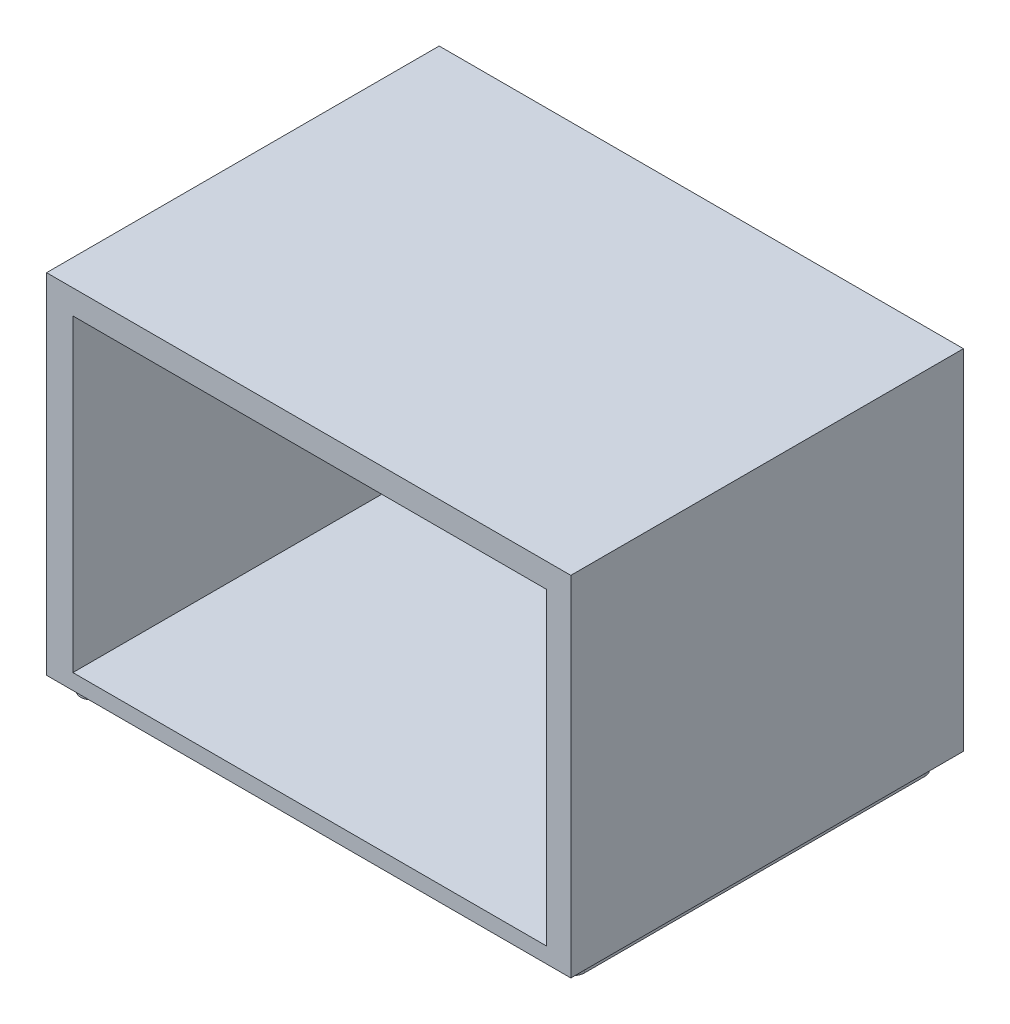
ISO-10303-21;
HEADER;
FILE_DESCRIPTION(('STEP AP214'),'2;1');
FILE_NAME('part.step','',(''),(''),'','','');
FILE_SCHEMA(('AUTOMOTIVE_DESIGN { 1 0 10303 214 1 1 1 1 }'));
ENDSEC;
DATA;
#1=APPLICATION_CONTEXT('core data for automotive mechanical design processes');
#2=APPLICATION_PROTOCOL_DEFINITION('international standard','automotive_design',2000,#1);
#3=PRODUCT_CONTEXT('',#1,'mechanical');
#4=PRODUCT('Part','Part','',(#3));
#5=PRODUCT_RELATED_PRODUCT_CATEGORY('part','',(#4));
#6=PRODUCT_DEFINITION_FORMATION('','',#4);
#7=PRODUCT_DEFINITION_CONTEXT('part definition',#1,'design');
#8=PRODUCT_DEFINITION('design','',#6,#7);
#9=PRODUCT_DEFINITION_SHAPE('','',#8);
#10=(LENGTH_UNIT() NAMED_UNIT(*) SI_UNIT(.MILLI.,.METRE.));
#11=(NAMED_UNIT(*) PLANE_ANGLE_UNIT() SI_UNIT($,.RADIAN.));
#12=(NAMED_UNIT(*) SI_UNIT($,.STERADIAN.) SOLID_ANGLE_UNIT());
#13=UNCERTAINTY_MEASURE_WITH_UNIT(LENGTH_MEASURE(1.E-05),#10,'distance_accuracy_value','');
#14=(GEOMETRIC_REPRESENTATION_CONTEXT(3) GLOBAL_UNCERTAINTY_ASSIGNED_CONTEXT((#13)) GLOBAL_UNIT_ASSIGNED_CONTEXT((#10,
#11,#12)) REPRESENTATION_CONTEXT('',''));
#15=CARTESIAN_POINT('',(0.,0.,0.));
#16=DIRECTION('',(0.,0.,1.));
#17=DIRECTION('',(1.,0.,0.));
#18=AXIS2_PLACEMENT_3D('',#15,#16,#17);
#19=CARTESIAN_POINT('',(-121.13189844911,-37.6511587485516,83.9349455030879));
#20=DIRECTION('',(0.,1.,0.));
#21=DIRECTION('',(0.,0.,1.));
#22=AXIS2_PLACEMENT_3D('',#19,#20,#21);
#23=PLANE('',#22);
#24=CARTESIAN_POINT('',(-115.960654563851,-37.6511587485516,79.4646031404795));
#25=DIRECTION('',(0.,-1.,0.));
#26=DIRECTION('',(0.,0.,-1.));
#27=AXIS2_PLACEMENT_3D('',#24,#25,#26);
#28=CIRCLE('',#27,2.34962201041589);
#29=CARTESIAN_POINT('',(-113.611032553435,-37.6511587485516,79.4646031404796));
#30=VERTEX_POINT('',#29);
#31=CARTESIAN_POINT('',(-118.310276574267,-37.6511587485516,79.4646031404795));
#32=VERTEX_POINT('',#31);
#33=EDGE_CURVE('E190',#30,#32,#28,.T.);
#34=ORIENTED_EDGE('',*,*,#33,.F.);
#35=DIRECTION('',(0.,0.,1.));
#36=VECTOR('',#35,1.);
#37=CARTESIAN_POINT('',(-113.611032553435,-37.6511587485516,79.4646031404796));
#38=LINE('',#37,#36);
#39=CARTESIAN_POINT('',(-113.611032553435,-37.6511587485516,6.68923510410833));
#40=VERTEX_POINT('',#39);
#41=EDGE_CURVE('E203',#40,#30,#38,.T.);
#42=ORIENTED_EDGE('',*,*,#41,.F.);
#43=CARTESIAN_POINT('',(-115.960654563851,-37.6511587485516,6.68923510410832));
#44=DIRECTION('',(0.,-1.,0.));
#45=DIRECTION('',(0.,0.,-1.));
#46=AXIS2_PLACEMENT_3D('',#43,#44,#45);
#47=CIRCLE('',#46,2.34962201041589);
#48=CARTESIAN_POINT('',(-118.310276574267,-37.6511587485516,6.68923510410831));
#49=VERTEX_POINT('',#48);
#50=EDGE_CURVE('E212',#49,#40,#47,.T.);
#51=ORIENTED_EDGE('',*,*,#50,.F.);
#52=DIRECTION('',(0.,0.,-1.));
#53=VECTOR('',#52,1.);
#54=CARTESIAN_POINT('',(-118.310276574267,-37.6511587485516,79.4646031404795));
#55=LINE('',#54,#53);
#56=EDGE_CURVE('E193',#32,#49,#55,.T.);
#57=ORIENTED_EDGE('',*,*,#56,.F.);
#58=EDGE_LOOP('',(#34,#42,#51,#57));
#59=FACE_BOUND('',#58,.T.);
#60=DIRECTION('',(1.,0.,0.));
#61=VECTOR('',#60,1.);
#62=CARTESIAN_POINT('',(-121.13189844911,-37.6511587485516,0.));
#63=LINE('',#62,#61);
#64=CARTESIAN_POINT('',(-121.13189844911,-37.6511587485516,0.));
#65=VERTEX_POINT('',#64);
#66=CARTESIAN_POINT('',(-9.05403054644482,-37.6511587485516,0.));
#67=VERTEX_POINT('',#66);
#68=EDGE_CURVE('E274',#65,#67,#63,.T.);
#69=ORIENTED_EDGE('',*,*,#68,.T.);
#70=DIRECTION('',(0.,0.,-1.));
#71=VECTOR('',#70,1.);
#72=CARTESIAN_POINT('',(-9.05403054644482,-37.6511587485516,83.9349455030879));
#73=LINE('',#72,#71);
#74=CARTESIAN_POINT('',(-9.05403054644482,-37.6511587485516,83.9349455030879));
#75=VERTEX_POINT('',#74);
#76=EDGE_CURVE('E308',#75,#67,#73,.T.);
#77=ORIENTED_EDGE('',*,*,#76,.F.);
#78=DIRECTION('',(1.,0.,0.));
#79=VECTOR('',#78,1.);
#80=CARTESIAN_POINT('',(-121.13189844911,-37.6511587485516,83.9349455030879));
#81=LINE('',#80,#79);
#82=CARTESIAN_POINT('',(-121.13189844911,-37.6511587485516,83.9349455030879));
#83=VERTEX_POINT('',#82);
#84=EDGE_CURVE('E281',#83,#75,#81,.T.);
#85=ORIENTED_EDGE('',*,*,#84,.F.);
#86=DIRECTION('',(0.,0.,-1.));
#87=VECTOR('',#86,1.);
#88=CARTESIAN_POINT('',(-121.13189844911,-37.6511587485516,83.9349455030879));
#89=LINE('',#88,#87);
#90=EDGE_CURVE('E292',#83,#65,#89,.T.);
#91=ORIENTED_EDGE('',*,*,#90,.T.);
#92=EDGE_LOOP('',(#69,#77,#85,#91));
#93=FACE_BOUND('',#92,.T.);
#94=CARTESIAN_POINT('',(-13.4141400478534,-37.6511587485516,78.9851501921355));
#95=DIRECTION('',(0.,-1.,0.));
#96=DIRECTION('',(0.,0.,-1.));
#97=AXIS2_PLACEMENT_3D('',#94,#95,#96);
#98=CIRCLE('',#97,2.34962201041589);
#99=CARTESIAN_POINT('',(-11.0645180374375,-37.6511587485516,78.9851501921355));
#100=VERTEX_POINT('',#99);
#101=CARTESIAN_POINT('',(-15.7637620582692,-37.6511587485516,78.9851501921355));
#102=VERTEX_POINT('',#101);
#103=EDGE_CURVE('E189',#100,#102,#98,.T.);
#104=ORIENTED_EDGE('',*,*,#103,.F.);
#105=DIRECTION('',(0.,0.,1.));
#106=VECTOR('',#105,1.);
#107=CARTESIAN_POINT('',(-11.0645180374375,-37.6511587485516,78.9851501921355));
#108=LINE('',#107,#106);
#109=CARTESIAN_POINT('',(-11.0645180374372,-37.6511587485516,6.20978215576427));
#110=VERTEX_POINT('',#109);
#111=EDGE_CURVE('E186',#110,#100,#108,.T.);
#112=ORIENTED_EDGE('',*,*,#111,.F.);
#113=CARTESIAN_POINT('',(-13.4141400478531,-37.6511587485516,6.20978215576426));
#114=DIRECTION('',(0.,-1.,0.));
#115=DIRECTION('',(0.,0.,-1.));
#116=AXIS2_PLACEMENT_3D('',#113,#114,#115);
#117=CIRCLE('',#116,2.34962201041589);
#118=CARTESIAN_POINT('',(-15.763762058269,-37.6511587485516,6.20978215576425));
#119=VERTEX_POINT('',#118);
#120=EDGE_CURVE('E53',#119,#110,#117,.T.);
#121=ORIENTED_EDGE('',*,*,#120,.F.);
#122=DIRECTION('',(0.,0.,-1.));
#123=VECTOR('',#122,1.);
#124=CARTESIAN_POINT('',(-15.7637620582692,-37.6511587485516,78.9851501921355));
#125=LINE('',#124,#123);
#126=EDGE_CURVE('E48',#102,#119,#125,.T.);
#127=ORIENTED_EDGE('',*,*,#126,.F.);
#128=EDGE_LOOP('',(#104,#112,#121,#127));
#129=FACE_BOUND('',#128,.T.);
#130=ADVANCED_FACE('F34',(#59,#93,#129),#23,.F.);
#131=CARTESIAN_POINT('',(-9.05403054644482,36.9006373117034,83.9349455030879));
#132=DIRECTION('',(1.,0.,0.));
#133=DIRECTION('',(0.,0.,-1.));
#134=AXIS2_PLACEMENT_3D('',#131,#132,#133);
#135=PLANE('',#134);
#136=DIRECTION('',(0.,-1.,0.));
#137=VECTOR('',#136,1.);
#138=CARTESIAN_POINT('',(-9.05403054644482,36.9006373117034,0.));
#139=LINE('',#138,#137);
#140=CARTESIAN_POINT('',(-9.05403054644482,36.9006373117034,0.));
#141=VERTEX_POINT('',#140);
#142=EDGE_CURVE('E295',#141,#67,#139,.T.);
#143=ORIENTED_EDGE('',*,*,#142,.F.);
#144=DIRECTION('',(0.,0.,-1.));
#145=VECTOR('',#144,1.);
#146=CARTESIAN_POINT('',(-9.05403054644482,36.9006373117034,83.9349455030879));
#147=LINE('',#146,#145);
#148=CARTESIAN_POINT('',(-9.05403054644482,36.9006373117034,83.9349455030879));
#149=VERTEX_POINT('',#148);
#150=EDGE_CURVE('E306',#149,#141,#147,.T.);
#151=ORIENTED_EDGE('',*,*,#150,.F.);
#152=DIRECTION('',(0.,-1.,0.));
#153=VECTOR('',#152,1.);
#154=CARTESIAN_POINT('',(-9.05403054644482,36.9006373117034,83.9349455030879));
#155=LINE('',#154,#153);
#156=EDGE_CURVE('E283',#149,#75,#155,.T.);
#157=ORIENTED_EDGE('',*,*,#156,.T.);
#158=ORIENTED_EDGE('',*,*,#76,.T.);
#159=EDGE_LOOP('',(#143,#151,#157,#158));
#160=FACE_BOUND('',#159,.T.);
#161=ADVANCED_FACE('F373',(#160),#135,.T.);
#162=CARTESIAN_POINT('',(-121.13189844911,36.9006373117034,83.9349455030879));
#163=DIRECTION('',(0.,1.,0.));
#164=DIRECTION('',(0.,0.,1.));
#165=AXIS2_PLACEMENT_3D('',#162,#163,#164);
#166=PLANE('',#165);
#167=DIRECTION('',(1.,0.,0.));
#168=VECTOR('',#167,1.);
#169=CARTESIAN_POINT('',(-121.13189844911,36.9006373117034,0.));
#170=LINE('',#169,#168);
#171=CARTESIAN_POINT('',(-121.13189844911,36.9006373117034,0.));
#172=VERTEX_POINT('',#171);
#173=EDGE_CURVE('E298',#172,#141,#170,.T.);
#174=ORIENTED_EDGE('',*,*,#173,.F.);
#175=DIRECTION('',(0.,0.,-1.));
#176=VECTOR('',#175,1.);
#177=CARTESIAN_POINT('',(-121.13189844911,36.9006373117034,83.9349455030879));
#178=LINE('',#177,#176);
#179=CARTESIAN_POINT('',(-121.13189844911,36.9006373117034,83.9349455030879));
#180=VERTEX_POINT('',#179);
#181=EDGE_CURVE('E304',#180,#172,#178,.T.);
#182=ORIENTED_EDGE('',*,*,#181,.F.);
#183=DIRECTION('',(1.,0.,0.));
#184=VECTOR('',#183,1.);
#185=CARTESIAN_POINT('',(-121.13189844911,36.9006373117034,83.9349455030879));
#186=LINE('',#185,#184);
#187=EDGE_CURVE('E287',#180,#149,#186,.T.);
#188=ORIENTED_EDGE('',*,*,#187,.T.);
#189=ORIENTED_EDGE('',*,*,#150,.T.);
#190=EDGE_LOOP('',(#174,#182,#188,#189));
#191=FACE_BOUND('',#190,.T.);
#192=ADVANCED_FACE('F376',(#191),#166,.T.);
#193=CARTESIAN_POINT('',(-121.13189844911,36.9006373117034,83.9349455030879));
#194=DIRECTION('',(1.,0.,0.));
#195=DIRECTION('',(0.,0.,-1.));
#196=AXIS2_PLACEMENT_3D('',#193,#194,#195);
#197=PLANE('',#196);
#198=DIRECTION('',(0.,-1.,0.));
#199=VECTOR('',#198,1.);
#200=CARTESIAN_POINT('',(-121.13189844911,36.9006373117034,0.));
#201=LINE('',#200,#199);
#202=EDGE_CURVE('E284',#172,#65,#201,.T.);
#203=ORIENTED_EDGE('',*,*,#202,.T.);
#204=ORIENTED_EDGE('',*,*,#90,.F.);
#205=DIRECTION('',(0.,-1.,0.));
#206=VECTOR('',#205,1.);
#207=CARTESIAN_POINT('',(-121.13189844911,36.9006373117034,83.9349455030879));
#208=LINE('',#207,#206);
#209=EDGE_CURVE('E290',#180,#83,#208,.T.);
#210=ORIENTED_EDGE('',*,*,#209,.F.);
#211=ORIENTED_EDGE('',*,*,#181,.T.);
#212=EDGE_LOOP('',(#203,#204,#210,#211));
#213=FACE_BOUND('',#212,.T.);
#214=ADVANCED_FACE('F361',(#213),#197,.F.);
#215=CARTESIAN_POINT('',(0.,0.,83.9349455030879));
#216=DIRECTION('',(0.,0.,-1.));
#217=DIRECTION('',(-1.,0.,0.));
#218=AXIS2_PLACEMENT_3D('',#215,#216,#217);
#219=PLANE('',#218);
#220=DIRECTION('',(1.,0.,0.));
#221=VECTOR('',#220,1.);
#222=CARTESIAN_POINT('',(-115.507853429078,-34.3284139148405,83.9349455030879));
#223=LINE('',#222,#221);
#224=CARTESIAN_POINT('',(-115.507853429078,-34.3284139148405,83.9349455030879));
#225=VERTEX_POINT('',#224);
#226=CARTESIAN_POINT('',(-14.2765098254403,-34.3284139148405,83.9349455030879));
#227=VERTEX_POINT('',#226);
#228=EDGE_CURVE('E264',#225,#227,#223,.T.);
#229=ORIENTED_EDGE('',*,*,#228,.F.);
#230=DIRECTION('',(0.,-1.,0.));
#231=VECTOR('',#230,1.);
#232=CARTESIAN_POINT('',(-115.507853429078,31.7063531331074,83.9349455030879));
#233=LINE('',#232,#231);
#234=CARTESIAN_POINT('',(-115.507853429078,31.7063531331074,83.9349455030879));
#235=VERTEX_POINT('',#234);
#236=EDGE_CURVE('E242',#235,#225,#233,.T.);
#237=ORIENTED_EDGE('',*,*,#236,.F.);
#238=DIRECTION('',(-1.,0.,0.));
#239=VECTOR('',#238,1.);
#240=CARTESIAN_POINT('',(-115.507853429078,31.7063531331074,83.9349455030879));
#241=LINE('',#240,#239);
#242=CARTESIAN_POINT('',(-14.2765098254403,31.7063531331074,83.9349455030879));
#243=VERTEX_POINT('',#242);
#244=EDGE_CURVE('E253',#243,#235,#241,.T.);
#245=ORIENTED_EDGE('',*,*,#244,.F.);
#246=DIRECTION('',(0.,1.,0.));
#247=VECTOR('',#246,1.);
#248=CARTESIAN_POINT('',(-14.2765098254403,31.7063531331074,83.9349455030879));
#249=LINE('',#248,#247);
#250=EDGE_CURVE('E267',#227,#243,#249,.T.);
#251=ORIENTED_EDGE('',*,*,#250,.F.);
#252=EDGE_LOOP('',(#229,#237,#245,#251));
#253=FACE_BOUND('',#252,.T.);
#254=ORIENTED_EDGE('',*,*,#84,.T.);
#255=ORIENTED_EDGE('',*,*,#156,.F.);
#256=ORIENTED_EDGE('',*,*,#187,.F.);
#257=ORIENTED_EDGE('',*,*,#209,.T.);
#258=EDGE_LOOP('',(#254,#255,#256,#257));
#259=FACE_BOUND('',#258,.T.);
#260=ADVANCED_FACE('F358',(#253,#259),#219,.F.);
#261=CARTESIAN_POINT('',(0.,0.,0.));
#262=DIRECTION('',(0.,0.,-1.));
#263=DIRECTION('',(-1.,0.,0.));
#264=AXIS2_PLACEMENT_3D('',#261,#262,#263);
#265=PLANE('',#264);
#266=DIRECTION('',(0.,1.,0.));
#267=VECTOR('',#266,1.);
#268=CARTESIAN_POINT('',(-76.2562519764933,0.,0.));
#269=LINE('',#268,#267);
#270=CARTESIAN_POINT('',(-76.2562519764933,-7.70811573139563,0.));
#271=VERTEX_POINT('',#270);
#272=CARTESIAN_POINT('',(-76.2562519764933,21.7290269388402,0.));
#273=VERTEX_POINT('',#272);
#274=EDGE_CURVE('E11',#271,#273,#269,.T.);
#275=ORIENTED_EDGE('',*,*,#274,.F.);
#276=DIRECTION('',(-1.,0.,0.));
#277=VECTOR('',#276,1.);
#278=CARTESIAN_POINT('',(0.,-7.70811573139563,0.));
#279=LINE('',#278,#277);
#280=CARTESIAN_POINT('',(-36.8112975703626,-7.70811573139563,0.));
#281=VERTEX_POINT('',#280);
#282=EDGE_CURVE('E310',#281,#271,#279,.T.);
#283=ORIENTED_EDGE('',*,*,#282,.F.);
#284=DIRECTION('',(0.,-1.,0.));
#285=VECTOR('',#284,1.);
#286=CARTESIAN_POINT('',(-36.8112975703626,0.,0.));
#287=LINE('',#286,#285);
#288=CARTESIAN_POINT('',(-36.8112975703626,21.7290269388402,0.));
#289=VERTEX_POINT('',#288);
#290=EDGE_CURVE('E312',#289,#281,#287,.T.);
#291=ORIENTED_EDGE('',*,*,#290,.F.);
#292=DIRECTION('',(1.,0.,0.));
#293=VECTOR('',#292,1.);
#294=CARTESIAN_POINT('',(0.,21.7290269388402,0.));
#295=LINE('',#294,#293);
#296=EDGE_CURVE('E41',#273,#289,#295,.T.);
#297=ORIENTED_EDGE('',*,*,#296,.F.);
#298=EDGE_LOOP('',(#275,#283,#291,#297));
#299=FACE_BOUND('',#298,.T.);
#300=ORIENTED_EDGE('',*,*,#68,.F.);
#301=ORIENTED_EDGE('',*,*,#202,.F.);
#302=ORIENTED_EDGE('',*,*,#173,.T.);
#303=ORIENTED_EDGE('',*,*,#142,.T.);
#304=EDGE_LOOP('',(#300,#301,#302,#303));
#305=FACE_BOUND('',#304,.T.);
#306=ADVANCED_FACE('F327',(#299,#305),#265,.T.);
#307=CARTESIAN_POINT('',(-115.507853429078,31.7063531331074,7.29051474011355));
#308=DIRECTION('',(-1.,0.,0.));
#309=DIRECTION('',(0.,0.,1.));
#310=AXIS2_PLACEMENT_3D('',#307,#308,#309);
#311=PLANE('',#310);
#312=ORIENTED_EDGE('',*,*,#236,.T.);
#313=DIRECTION('',(0.,0.,1.));
#314=VECTOR('',#313,1.);
#315=CARTESIAN_POINT('',(-115.507853429078,-34.3284139148405,7.29051474011355));
#316=LINE('',#315,#314);
#317=CARTESIAN_POINT('',(-115.507853429078,-34.3284139148405,7.29051474011355));
#318=VERTEX_POINT('',#317);
#319=EDGE_CURVE('E262',#318,#225,#316,.T.);
#320=ORIENTED_EDGE('',*,*,#319,.F.);
#321=DIRECTION('',(0.,-1.,0.));
#322=VECTOR('',#321,1.);
#323=CARTESIAN_POINT('',(-115.507853429078,31.7063531331074,7.29051474011355));
#324=LINE('',#323,#322);
#325=CARTESIAN_POINT('',(-115.507853429078,31.7063531331074,7.29051474011355));
#326=VERTEX_POINT('',#325);
#327=EDGE_CURVE('E249',#326,#318,#324,.T.);
#328=ORIENTED_EDGE('',*,*,#327,.F.);
#329=DIRECTION('',(0.,0.,1.));
#330=VECTOR('',#329,1.);
#331=CARTESIAN_POINT('',(-115.507853429078,31.7063531331074,7.29051474011355));
#332=LINE('',#331,#330);
#333=EDGE_CURVE('E272',#326,#235,#332,.T.);
#334=ORIENTED_EDGE('',*,*,#333,.T.);
#335=EDGE_LOOP('',(#312,#320,#328,#334));
#336=FACE_BOUND('',#335,.T.);
#337=ADVANCED_FACE('F346',(#336),#311,.F.);
#338=CARTESIAN_POINT('',(-115.507853429078,31.7063531331074,7.29051474011355));
#339=DIRECTION('',(0.,1.,0.));
#340=DIRECTION('',(0.,0.,1.));
#341=AXIS2_PLACEMENT_3D('',#338,#339,#340);
#342=PLANE('',#341);
#343=ORIENTED_EDGE('',*,*,#244,.T.);
#344=ORIENTED_EDGE('',*,*,#333,.F.);
#345=DIRECTION('',(-1.,0.,0.));
#346=VECTOR('',#345,1.);
#347=CARTESIAN_POINT('',(-115.507853429078,31.7063531331074,7.29051474011355));
#348=LINE('',#347,#346);
#349=CARTESIAN_POINT('',(-14.2765098254403,31.7063531331074,7.29051474011355));
#350=VERTEX_POINT('',#349);
#351=EDGE_CURVE('E259',#350,#326,#348,.T.);
#352=ORIENTED_EDGE('',*,*,#351,.F.);
#353=DIRECTION('',(0.,0.,1.));
#354=VECTOR('',#353,1.);
#355=CARTESIAN_POINT('',(-14.2765098254403,31.7063531331074,7.29051474011355));
#356=LINE('',#355,#354);
#357=EDGE_CURVE('E275',#350,#243,#356,.T.);
#358=ORIENTED_EDGE('',*,*,#357,.T.);
#359=EDGE_LOOP('',(#343,#344,#352,#358));
#360=FACE_BOUND('',#359,.T.);
#361=ADVANCED_FACE('F355',(#360),#342,.F.);
#362=CARTESIAN_POINT('',(-14.2765098254403,31.7063531331074,7.29051474011355));
#363=DIRECTION('',(1.,0.,0.));
#364=DIRECTION('',(0.,0.,-1.));
#365=AXIS2_PLACEMENT_3D('',#362,#363,#364);
#366=PLANE('',#365);
#367=ORIENTED_EDGE('',*,*,#250,.T.);
#368=ORIENTED_EDGE('',*,*,#357,.F.);
#369=DIRECTION('',(0.,1.,0.));
#370=VECTOR('',#369,1.);
#371=CARTESIAN_POINT('',(-14.2765098254403,31.7063531331074,7.29051474011355));
#372=LINE('',#371,#370);
#373=CARTESIAN_POINT('',(-14.2765098254403,-34.3284139148405,7.29051474011355));
#374=VERTEX_POINT('',#373);
#375=EDGE_CURVE('E256',#374,#350,#372,.T.);
#376=ORIENTED_EDGE('',*,*,#375,.F.);
#377=DIRECTION('',(0.,0.,1.));
#378=VECTOR('',#377,1.);
#379=CARTESIAN_POINT('',(-14.2765098254403,-34.3284139148405,7.29051474011355));
#380=LINE('',#379,#378);
#381=EDGE_CURVE('E277',#374,#227,#380,.T.);
#382=ORIENTED_EDGE('',*,*,#381,.T.);
#383=EDGE_LOOP('',(#367,#368,#376,#382));
#384=FACE_BOUND('',#383,.T.);
#385=ADVANCED_FACE('F353',(#384),#366,.F.);
#386=CARTESIAN_POINT('',(-115.507853429078,-34.3284139148405,7.29051474011355));
#387=DIRECTION('',(0.,-1.,0.));
#388=DIRECTION('',(0.,0.,-1.));
#389=AXIS2_PLACEMENT_3D('',#386,#387,#388);
#390=PLANE('',#389);
#391=ORIENTED_EDGE('',*,*,#228,.T.);
#392=ORIENTED_EDGE('',*,*,#381,.F.);
#393=DIRECTION('',(1.,0.,0.));
#394=VECTOR('',#393,1.);
#395=CARTESIAN_POINT('',(-115.507853429078,-34.3284139148405,7.29051474011355));
#396=LINE('',#395,#394);
#397=EDGE_CURVE('E252',#318,#374,#396,.T.);
#398=ORIENTED_EDGE('',*,*,#397,.F.);
#399=ORIENTED_EDGE('',*,*,#319,.T.);
#400=EDGE_LOOP('',(#391,#392,#398,#399));
#401=FACE_BOUND('',#400,.T.);
#402=ADVANCED_FACE('F340',(#401),#390,.F.);
#403=CARTESIAN_POINT('',(0.,0.,7.29051474011355));
#404=DIRECTION('',(0.,0.,1.));
#405=DIRECTION('',(1.,0.,0.));
#406=AXIS2_PLACEMENT_3D('',#403,#404,#405);
#407=PLANE('',#406);
#408=DIRECTION('',(0.,-1.,0.));
#409=VECTOR('',#408,1.);
#410=CARTESIAN_POINT('',(-76.2562519764933,21.7290269388402,7.29051474011355));
#411=LINE('',#410,#409);
#412=CARTESIAN_POINT('',(-76.2562519764933,21.7290269388402,7.29051474011355));
#413=VERTEX_POINT('',#412);
#414=CARTESIAN_POINT('',(-76.2562519764933,-7.70811573139563,7.29051474011355));
#415=VERTEX_POINT('',#414);
#416=EDGE_CURVE('E228',#413,#415,#411,.T.);
#417=ORIENTED_EDGE('',*,*,#416,.F.);
#418=DIRECTION('',(-1.,0.,0.));
#419=VECTOR('',#418,1.);
#420=CARTESIAN_POINT('',(-76.2562519764933,21.7290269388402,7.29051474011355));
#421=LINE('',#420,#419);
#422=CARTESIAN_POINT('',(-36.8112975703626,21.7290269388402,7.29051474011355));
#423=VERTEX_POINT('',#422);
#424=EDGE_CURVE('E236',#423,#413,#421,.T.);
#425=ORIENTED_EDGE('',*,*,#424,.F.);
#426=DIRECTION('',(0.,1.,0.));
#427=VECTOR('',#426,1.);
#428=CARTESIAN_POINT('',(-36.8112975703626,21.7290269388402,7.29051474011355));
#429=LINE('',#428,#427);
#430=CARTESIAN_POINT('',(-36.8112975703626,-7.70811573139563,7.29051474011355));
#431=VERTEX_POINT('',#430);
#432=EDGE_CURVE('E234',#431,#423,#429,.T.);
#433=ORIENTED_EDGE('',*,*,#432,.F.);
#434=DIRECTION('',(1.,0.,0.));
#435=VECTOR('',#434,1.);
#436=CARTESIAN_POINT('',(-76.2562519764933,-7.70811573139563,7.29051474011355));
#437=LINE('',#436,#435);
#438=EDGE_CURVE('E231',#415,#431,#437,.T.);
#439=ORIENTED_EDGE('',*,*,#438,.F.);
#440=EDGE_LOOP('',(#417,#425,#433,#439));
#441=FACE_BOUND('',#440,.T.);
#442=ORIENTED_EDGE('',*,*,#327,.T.);
#443=ORIENTED_EDGE('',*,*,#397,.T.);
#444=ORIENTED_EDGE('',*,*,#375,.T.);
#445=ORIENTED_EDGE('',*,*,#351,.T.);
#446=EDGE_LOOP('',(#442,#443,#444,#445));
#447=FACE_BOUND('',#446,.T.);
#448=ADVANCED_FACE('F337',(#441,#447),#407,.T.);
#449=CARTESIAN_POINT('',(-76.2562519764933,21.7290269388402,-80.8474852598865));
#450=DIRECTION('',(-1.,0.,0.));
#451=DIRECTION('',(0.,0.,1.));
#452=AXIS2_PLACEMENT_3D('',#449,#450,#451);
#453=PLANE('',#452);
#454=ORIENTED_EDGE('',*,*,#274,.T.);
#455=DIRECTION('',(0.,0.,1.));
#456=VECTOR('',#455,1.);
#457=CARTESIAN_POINT('',(-76.2562519764933,21.7290269388402,-80.8474852598865));
#458=LINE('',#457,#456);
#459=EDGE_CURVE('E240',#273,#413,#458,.T.);
#460=ORIENTED_EDGE('',*,*,#459,.T.);
#461=ORIENTED_EDGE('',*,*,#416,.T.);
#462=DIRECTION('',(0.,0.,1.));
#463=VECTOR('',#462,1.);
#464=CARTESIAN_POINT('',(-76.2562519764933,-7.70811573139563,-80.8474852598865));
#465=LINE('',#464,#463);
#466=EDGE_CURVE('E239',#271,#415,#465,.T.);
#467=ORIENTED_EDGE('',*,*,#466,.F.);
#468=EDGE_LOOP('',(#454,#460,#461,#467));
#469=FACE_BOUND('',#468,.T.);
#470=ADVANCED_FACE('F333',(#469),#453,.F.);
#471=CARTESIAN_POINT('',(-76.2562519764933,21.7290269388402,-80.8474852598865));
#472=DIRECTION('',(0.,1.,0.));
#473=DIRECTION('',(0.,0.,1.));
#474=AXIS2_PLACEMENT_3D('',#471,#472,#473);
#475=PLANE('',#474);
#476=ORIENTED_EDGE('',*,*,#296,.T.);
#477=DIRECTION('',(0.,0.,1.));
#478=VECTOR('',#477,1.);
#479=CARTESIAN_POINT('',(-36.8112975703626,21.7290269388402,-80.8474852598865));
#480=LINE('',#479,#478);
#481=EDGE_CURVE('E243',#289,#423,#480,.T.);
#482=ORIENTED_EDGE('',*,*,#481,.T.);
#483=ORIENTED_EDGE('',*,*,#424,.T.);
#484=ORIENTED_EDGE('',*,*,#459,.F.);
#485=EDGE_LOOP('',(#476,#482,#483,#484));
#486=FACE_BOUND('',#485,.T.);
#487=ADVANCED_FACE('F318',(#486),#475,.F.);
#488=CARTESIAN_POINT('',(-36.8112975703626,21.7290269388402,-80.8474852598865));
#489=DIRECTION('',(1.,0.,0.));
#490=DIRECTION('',(0.,0.,-1.));
#491=AXIS2_PLACEMENT_3D('',#488,#489,#490);
#492=PLANE('',#491);
#493=ORIENTED_EDGE('',*,*,#290,.T.);
#494=DIRECTION('',(0.,0.,1.));
#495=VECTOR('',#494,1.);
#496=CARTESIAN_POINT('',(-36.8112975703626,-7.70811573139563,-80.8474852598865));
#497=LINE('',#496,#495);
#498=EDGE_CURVE('E246',#281,#431,#497,.T.);
#499=ORIENTED_EDGE('',*,*,#498,.T.);
#500=ORIENTED_EDGE('',*,*,#432,.T.);
#501=ORIENTED_EDGE('',*,*,#481,.F.);
#502=EDGE_LOOP('',(#493,#499,#500,#501));
#503=FACE_BOUND('',#502,.T.);
#504=ADVANCED_FACE('F324',(#503),#492,.F.);
#505=CARTESIAN_POINT('',(-76.2562519764933,-7.70811573139563,-80.8474852598865));
#506=DIRECTION('',(0.,-1.,0.));
#507=DIRECTION('',(0.,0.,-1.));
#508=AXIS2_PLACEMENT_3D('',#505,#506,#507);
#509=PLANE('',#508);
#510=ORIENTED_EDGE('',*,*,#282,.T.);
#511=ORIENTED_EDGE('',*,*,#466,.T.);
#512=ORIENTED_EDGE('',*,*,#438,.T.);
#513=ORIENTED_EDGE('',*,*,#498,.F.);
#514=EDGE_LOOP('',(#510,#511,#512,#513));
#515=FACE_BOUND('',#514,.T.);
#516=ADVANCED_FACE('F331',(#515),#509,.F.);
#517=CARTESIAN_POINT('',(-115.960654563851,-40.1911587485516,79.4646031404795));
#518=DIRECTION('',(0.,1.,0.));
#519=DIRECTION('',(0.,0.,1.));
#520=AXIS2_PLACEMENT_3D('',#517,#518,#519);
#521=CYLINDRICAL_SURFACE('',#520,2.34962201041589);
#522=ORIENTED_EDGE('',*,*,#33,.T.);
#523=DIRECTION('',(0.,1.,0.));
#524=VECTOR('',#523,1.);
#525=CARTESIAN_POINT('',(-118.310276574267,-40.1911587485516,79.4646031404795));
#526=LINE('',#525,#524);
#527=CARTESIAN_POINT('',(-118.310276574267,-40.1911587485516,79.4646031404795));
#528=VERTEX_POINT('',#527);
#529=EDGE_CURVE('E225',#528,#32,#526,.T.);
#530=ORIENTED_EDGE('',*,*,#529,.F.);
#531=CARTESIAN_POINT('',(-115.960654563851,-40.1911587485516,79.4646031404795));
#532=DIRECTION('',(0.,-1.,0.));
#533=DIRECTION('',(0.,0.,-1.));
#534=AXIS2_PLACEMENT_3D('',#531,#532,#533);
#535=CIRCLE('',#534,2.34962201041589);
#536=CARTESIAN_POINT('',(-113.611032553435,-40.1911587485516,79.4646031404796));
#537=VERTEX_POINT('',#536);
#538=EDGE_CURVE('E199',#537,#528,#535,.T.);
#539=ORIENTED_EDGE('',*,*,#538,.F.);
#540=DIRECTION('',(0.,1.,0.));
#541=VECTOR('',#540,1.);
#542=CARTESIAN_POINT('',(-113.611032553435,-40.1911587485516,79.4646031404796));
#543=LINE('',#542,#541);
#544=EDGE_CURVE('E208',#537,#30,#543,.T.);
#545=ORIENTED_EDGE('',*,*,#544,.T.);
#546=EDGE_LOOP('',(#522,#530,#539,#545));
#547=FACE_BOUND('',#546,.T.);
#548=ADVANCED_FACE('F399',(#547),#521,.T.);
#549=CARTESIAN_POINT('',(-118.310276574267,-40.1911587485516,79.4646031404795));
#550=DIRECTION('',(1.,0.,0.));
#551=DIRECTION('',(0.,0.,-1.));
#552=AXIS2_PLACEMENT_3D('',#549,#550,#551);
#553=PLANE('',#552);
#554=ORIENTED_EDGE('',*,*,#56,.T.);
#555=DIRECTION('',(0.,1.,0.));
#556=VECTOR('',#555,1.);
#557=CARTESIAN_POINT('',(-118.310276574267,-40.1911587485516,6.68923510410831));
#558=LINE('',#557,#556);
#559=CARTESIAN_POINT('',(-118.310276574267,-40.1911587485516,6.68923510410831));
#560=VERTEX_POINT('',#559);
#561=EDGE_CURVE('E222',#560,#49,#558,.T.);
#562=ORIENTED_EDGE('',*,*,#561,.F.);
#563=DIRECTION('',(0.,0.,-1.));
#564=VECTOR('',#563,1.);
#565=CARTESIAN_POINT('',(-118.310276574267,-40.1911587485516,79.4646031404795));
#566=LINE('',#565,#564);
#567=EDGE_CURVE('E202',#528,#560,#566,.T.);
#568=ORIENTED_EDGE('',*,*,#567,.F.);
#569=ORIENTED_EDGE('',*,*,#529,.T.);
#570=EDGE_LOOP('',(#554,#562,#568,#569));
#571=FACE_BOUND('',#570,.T.);
#572=ADVANCED_FACE('F407',(#571),#553,.F.);
#573=CARTESIAN_POINT('',(-115.960654563851,-40.1911587485516,6.68923510410832));
#574=DIRECTION('',(0.,1.,0.));
#575=DIRECTION('',(0.,0.,1.));
#576=AXIS2_PLACEMENT_3D('',#573,#574,#575);
#577=CYLINDRICAL_SURFACE('',#576,2.34962201041589);
#578=ORIENTED_EDGE('',*,*,#50,.T.);
#579=DIRECTION('',(0.,1.,0.));
#580=VECTOR('',#579,1.);
#581=CARTESIAN_POINT('',(-113.611032553435,-40.1911587485516,6.68923510410833));
#582=LINE('',#581,#580);
#583=CARTESIAN_POINT('',(-113.611032553435,-40.1911587485516,6.68923510410833));
#584=VERTEX_POINT('',#583);
#585=EDGE_CURVE('E219',#584,#40,#582,.T.);
#586=ORIENTED_EDGE('',*,*,#585,.F.);
#587=CARTESIAN_POINT('',(-115.960654563851,-40.1911587485516,6.68923510410832));
#588=DIRECTION('',(0.,-1.,0.));
#589=DIRECTION('',(0.,0.,-1.));
#590=AXIS2_PLACEMENT_3D('',#587,#588,#589);
#591=CIRCLE('',#590,2.34962201041589);
#592=EDGE_CURVE('E205',#560,#584,#591,.T.);
#593=ORIENTED_EDGE('',*,*,#592,.F.);
#594=ORIENTED_EDGE('',*,*,#561,.T.);
#595=EDGE_LOOP('',(#578,#586,#593,#594));
#596=FACE_BOUND('',#595,.T.);
#597=ADVANCED_FACE('F405',(#596),#577,.T.);
#598=CARTESIAN_POINT('',(-113.611032553435,-40.1911587485516,79.4646031404796));
#599=DIRECTION('',(-1.,0.,0.));
#600=DIRECTION('',(0.,0.,1.));
#601=AXIS2_PLACEMENT_3D('',#598,#599,#600);
#602=PLANE('',#601);
#603=ORIENTED_EDGE('',*,*,#41,.T.);
#604=ORIENTED_EDGE('',*,*,#544,.F.);
#605=DIRECTION('',(0.,0.,1.));
#606=VECTOR('',#605,1.);
#607=CARTESIAN_POINT('',(-113.611032553435,-40.1911587485516,79.4646031404796));
#608=LINE('',#607,#606);
#609=EDGE_CURVE('E207',#584,#537,#608,.T.);
#610=ORIENTED_EDGE('',*,*,#609,.F.);
#611=ORIENTED_EDGE('',*,*,#585,.T.);
#612=EDGE_LOOP('',(#603,#604,#610,#611));
#613=FACE_BOUND('',#612,.T.);
#614=ADVANCED_FACE('F395',(#613),#602,.F.);
#615=CARTESIAN_POINT('',(-115.960654563851,-40.1911587485516,79.4646031404795));
#616=DIRECTION('',(0.,-1.,0.));
#617=DIRECTION('',(0.,0.,-1.));
#618=AXIS2_PLACEMENT_3D('',#615,#616,#617);
#619=PLANE('',#618);
#620=ORIENTED_EDGE('',*,*,#538,.T.);
#621=ORIENTED_EDGE('',*,*,#567,.T.);
#622=ORIENTED_EDGE('',*,*,#592,.T.);
#623=ORIENTED_EDGE('',*,*,#609,.T.);
#624=EDGE_LOOP('',(#620,#621,#622,#623));
#625=FACE_BOUND('',#624,.T.);
#626=ADVANCED_FACE('F401',(#625),#619,.T.);
#627=CARTESIAN_POINT('',(-13.4141400478534,-40.1911587485516,78.9851501921355));
#628=DIRECTION('',(0.,1.,0.));
#629=DIRECTION('',(0.,0.,1.));
#630=AXIS2_PLACEMENT_3D('',#627,#628,#629);
#631=CYLINDRICAL_SURFACE('',#630,2.34962201041589);
#632=ORIENTED_EDGE('',*,*,#103,.T.);
#633=DIRECTION('',(0.,1.,0.));
#634=VECTOR('',#633,1.);
#635=CARTESIAN_POINT('',(-15.7637620582692,-40.1911587485516,78.9851501921355));
#636=LINE('',#635,#634);
#637=CARTESIAN_POINT('',(-15.7637620582692,-40.1911587485516,78.9851501921355));
#638=VERTEX_POINT('',#637);
#639=EDGE_CURVE('E170',#638,#102,#636,.T.);
#640=ORIENTED_EDGE('',*,*,#639,.F.);
#641=CARTESIAN_POINT('',(-13.4141400478534,-40.1911587485516,78.9851501921355));
#642=DIRECTION('',(0.,-1.,0.));
#643=DIRECTION('',(0.,0.,-1.));
#644=AXIS2_PLACEMENT_3D('',#641,#642,#643);
#645=CIRCLE('',#644,2.34962201041589);
#646=CARTESIAN_POINT('',(-11.0645180374375,-40.1911587485516,78.9851501921355));
#647=VERTEX_POINT('',#646);
#648=EDGE_CURVE('E177',#647,#638,#645,.T.);
#649=ORIENTED_EDGE('',*,*,#648,.F.);
#650=DIRECTION('',(0.,1.,0.));
#651=VECTOR('',#650,1.);
#652=CARTESIAN_POINT('',(-11.0645180374375,-40.1911587485516,78.9851501921355));
#653=LINE('',#652,#651);
#654=EDGE_CURVE('E536',#647,#100,#653,.T.);
#655=ORIENTED_EDGE('',*,*,#654,.T.);
#656=EDGE_LOOP('',(#632,#640,#649,#655));
#657=FACE_BOUND('',#656,.T.);
#658=ADVANCED_FACE('F188',(#657),#631,.T.);
#659=CARTESIAN_POINT('',(-15.7637620582692,-40.1911587485516,78.9851501921355));
#660=DIRECTION('',(1.,0.,0.));
#661=DIRECTION('',(0.,0.,-1.));
#662=AXIS2_PLACEMENT_3D('',#659,#660,#661);
#663=PLANE('',#662);
#664=ORIENTED_EDGE('',*,*,#126,.T.);
#665=DIRECTION('',(0.,1.,0.));
#666=VECTOR('',#665,1.);
#667=CARTESIAN_POINT('',(-15.763762058269,-40.1911587485516,6.20978215576425));
#668=LINE('',#667,#666);
#669=CARTESIAN_POINT('',(-15.763762058269,-40.1911587485516,6.20978215576425));
#670=VERTEX_POINT('',#669);
#671=EDGE_CURVE('E173',#670,#119,#668,.T.);
#672=ORIENTED_EDGE('',*,*,#671,.F.);
#673=DIRECTION('',(0.,0.,-1.));
#674=VECTOR('',#673,1.);
#675=CARTESIAN_POINT('',(-15.7637620582692,-40.1911587485516,78.9851501921355));
#676=LINE('',#675,#674);
#677=EDGE_CURVE('E166',#638,#670,#676,.T.);
#678=ORIENTED_EDGE('',*,*,#677,.F.);
#679=ORIENTED_EDGE('',*,*,#639,.T.);
#680=EDGE_LOOP('',(#664,#672,#678,#679));
#681=FACE_BOUND('',#680,.T.);
#682=ADVANCED_FACE('F168',(#681),#663,.F.);
#683=CARTESIAN_POINT('',(-13.4141400478531,-40.1911587485516,6.20978215576426));
#684=DIRECTION('',(0.,1.,0.));
#685=DIRECTION('',(0.,0.,1.));
#686=AXIS2_PLACEMENT_3D('',#683,#684,#685);
#687=CYLINDRICAL_SURFACE('',#686,2.34962201041589);
#688=ORIENTED_EDGE('',*,*,#120,.T.);
#689=DIRECTION('',(0.,1.,0.));
#690=VECTOR('',#689,1.);
#691=CARTESIAN_POINT('',(-11.0645180374372,-40.1911587485516,6.20978215576427));
#692=LINE('',#691,#690);
#693=CARTESIAN_POINT('',(-11.0645180374372,-40.1911587485516,6.20978215576427));
#694=VERTEX_POINT('',#693);
#695=EDGE_CURVE('E195',#694,#110,#692,.T.);
#696=ORIENTED_EDGE('',*,*,#695,.F.);
#697=CARTESIAN_POINT('',(-13.4141400478531,-40.1911587485516,6.20978215576426));
#698=DIRECTION('',(0.,-1.,0.));
#699=DIRECTION('',(0.,0.,-1.));
#700=AXIS2_PLACEMENT_3D('',#697,#698,#699);
#701=CIRCLE('',#700,2.34962201041589);
#702=EDGE_CURVE('E176',#670,#694,#701,.T.);
#703=ORIENTED_EDGE('',*,*,#702,.F.);
#704=ORIENTED_EDGE('',*,*,#671,.T.);
#705=EDGE_LOOP('',(#688,#696,#703,#704));
#706=FACE_BOUND('',#705,.T.);
#707=ADVANCED_FACE('F503',(#706),#687,.T.);
#708=CARTESIAN_POINT('',(-11.0645180374375,-40.1911587485516,78.9851501921355));
#709=DIRECTION('',(-1.,0.,0.));
#710=DIRECTION('',(0.,0.,1.));
#711=AXIS2_PLACEMENT_3D('',#708,#709,#710);
#712=PLANE('',#711);
#713=ORIENTED_EDGE('',*,*,#111,.T.);
#714=ORIENTED_EDGE('',*,*,#654,.F.);
#715=DIRECTION('',(0.,0.,1.));
#716=VECTOR('',#715,1.);
#717=CARTESIAN_POINT('',(-11.0645180374375,-40.1911587485516,78.9851501921355));
#718=LINE('',#717,#716);
#719=EDGE_CURVE('E182',#694,#647,#718,.T.);
#720=ORIENTED_EDGE('',*,*,#719,.F.);
#721=ORIENTED_EDGE('',*,*,#695,.T.);
#722=EDGE_LOOP('',(#713,#714,#720,#721));
#723=FACE_BOUND('',#722,.T.);
#724=ADVANCED_FACE('F512',(#723),#712,.F.);
#725=CARTESIAN_POINT('',(-13.4141400478534,-40.1911587485516,78.9851501921355));
#726=DIRECTION('',(0.,-1.,0.));
#727=DIRECTION('',(0.,0.,-1.));
#728=AXIS2_PLACEMENT_3D('',#725,#726,#727);
#729=PLANE('',#728);
#730=ORIENTED_EDGE('',*,*,#648,.T.);
#731=ORIENTED_EDGE('',*,*,#677,.T.);
#732=ORIENTED_EDGE('',*,*,#702,.T.);
#733=ORIENTED_EDGE('',*,*,#719,.T.);
#734=EDGE_LOOP('',(#730,#731,#732,#733));
#735=FACE_BOUND('',#734,.T.);
#736=ADVANCED_FACE('F180',(#735),#729,.T.);
#737=CLOSED_SHELL('',(#130,#161,#192,#214,#260,#306,#337,#361,#385,#402,#448,#470,#487,#504,
#516,#548,#572,#597,#614,#626,#658,#682,#707,#724,#736));
#738=MANIFOLD_SOLID_BREP('B2',#737);
#739=ADVANCED_BREP_SHAPE_REPRESENTATION('',(#18,#738),#14);
#740=SHAPE_DEFINITION_REPRESENTATION(#9,#739);
ENDSEC;
END-ISO-10303-21;
